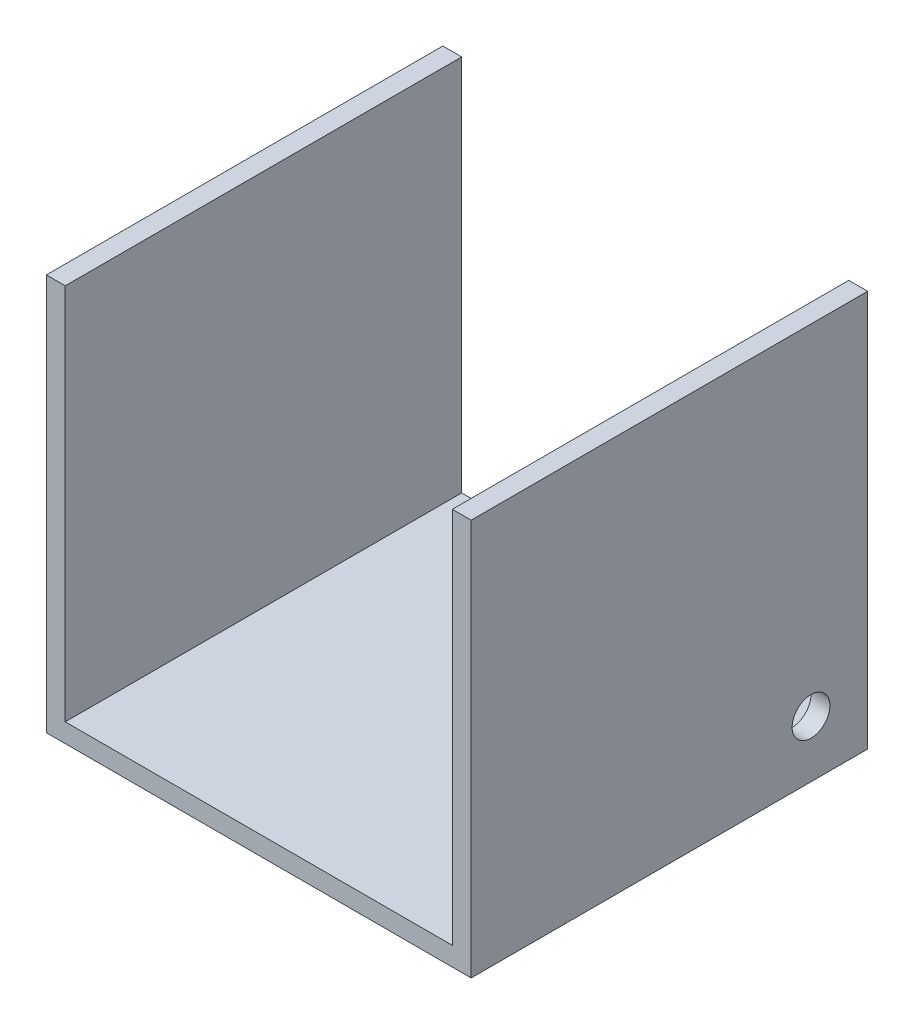
ISO-10303-21;
HEADER;
FILE_DESCRIPTION(('STEP AP214'),'2;1');
FILE_NAME('part.step','',(''),(''),'','','');
FILE_SCHEMA(('AUTOMOTIVE_DESIGN { 1 0 10303 214 1 1 1 1 }'));
ENDSEC;
DATA;
#1=APPLICATION_CONTEXT('core data for automotive mechanical design processes');
#2=APPLICATION_PROTOCOL_DEFINITION('international standard','automotive_design',2000,#1);
#3=PRODUCT_CONTEXT('',#1,'mechanical');
#4=PRODUCT('Part','Part','',(#3));
#5=PRODUCT_RELATED_PRODUCT_CATEGORY('part','',(#4));
#6=PRODUCT_DEFINITION_FORMATION('','',#4);
#7=PRODUCT_DEFINITION_CONTEXT('part definition',#1,'design');
#8=PRODUCT_DEFINITION('design','',#6,#7);
#9=PRODUCT_DEFINITION_SHAPE('','',#8);
#10=(LENGTH_UNIT() NAMED_UNIT(*) SI_UNIT(.MILLI.,.METRE.));
#11=(NAMED_UNIT(*) PLANE_ANGLE_UNIT() SI_UNIT($,.RADIAN.));
#12=(NAMED_UNIT(*) SI_UNIT($,.STERADIAN.) SOLID_ANGLE_UNIT());
#13=UNCERTAINTY_MEASURE_WITH_UNIT(LENGTH_MEASURE(1.E-05),#10,'distance_accuracy_value','');
#14=(GEOMETRIC_REPRESENTATION_CONTEXT(3) GLOBAL_UNCERTAINTY_ASSIGNED_CONTEXT((#13)) GLOBAL_UNIT_ASSIGNED_CONTEXT((#10,
#11,#12)) REPRESENTATION_CONTEXT('',''));
#15=CARTESIAN_POINT('',(0.,0.,0.));
#16=DIRECTION('',(0.,0.,1.));
#17=DIRECTION('',(1.,0.,0.));
#18=AXIS2_PLACEMENT_3D('',#15,#16,#17);
#19=CARTESIAN_POINT('',(0.,0.,-210.));
#20=DIRECTION('',(0.,-1.,0.));
#21=DIRECTION('',(0.,0.,-1.));
#22=AXIS2_PLACEMENT_3D('',#19,#20,#21);
#23=PLANE('',#22);
#24=CARTESIAN_POINT('',(107.,0.,-180.));
#25=DIRECTION('',(0.,1.,0.));
#26=DIRECTION('',(0.,0.,1.));
#27=AXIS2_PLACEMENT_3D('',#24,#25,#26);
#28=CIRCLE('',#27,1.44999999999999);
#29=CARTESIAN_POINT('',(107.,0.,-178.55));
#30=VERTEX_POINT('',#29);
#31=EDGE_CURVE('E464',#30,#30,#28,.T.);
#32=ORIENTED_EDGE('',*,*,#31,.T.);
#33=EDGE_LOOP('',(#32));
#34=FACE_BOUND('',#33,.T.);
#35=CARTESIAN_POINT('',(107.,0.,-131.4));
#36=DIRECTION('',(0.,1.,0.));
#37=DIRECTION('',(0.,0.,1.));
#38=AXIS2_PLACEMENT_3D('',#35,#36,#37);
#39=CIRCLE('',#38,1.44999999999999);
#40=CARTESIAN_POINT('',(107.,0.,-129.95));
#41=VERTEX_POINT('',#40);
#42=EDGE_CURVE('E477',#41,#41,#39,.T.);
#43=ORIENTED_EDGE('',*,*,#42,.T.);
#44=EDGE_LOOP('',(#43));
#45=FACE_BOUND('',#44,.T.);
#46=CARTESIAN_POINT('',(165.,0.,-131.4));
#47=DIRECTION('',(0.,1.,0.));
#48=DIRECTION('',(0.,0.,1.));
#49=AXIS2_PLACEMENT_3D('',#46,#47,#48);
#50=CIRCLE('',#49,1.45000000000001);
#51=CARTESIAN_POINT('',(165.,0.,-129.95));
#52=VERTEX_POINT('',#51);
#53=EDGE_CURVE('E240',#52,#52,#50,.T.);
#54=ORIENTED_EDGE('',*,*,#53,.T.);
#55=EDGE_LOOP('',(#54));
#56=FACE_BOUND('',#55,.T.);
#57=DIRECTION('',(1.,0.,0.));
#58=VECTOR('',#57,1.);
#59=CARTESIAN_POINT('',(0.,0.,0.));
#60=LINE('',#59,#58);
#61=CARTESIAN_POINT('',(0.,0.,0.));
#62=VERTEX_POINT('',#61);
#63=CARTESIAN_POINT('',(225.,0.,0.));
#64=VERTEX_POINT('',#63);
#65=EDGE_CURVE('E147',#62,#64,#60,.T.);
#66=ORIENTED_EDGE('',*,*,#65,.F.);
#67=DIRECTION('',(0.,0.,1.));
#68=VECTOR('',#67,1.);
#69=CARTESIAN_POINT('',(0.,0.,-210.));
#70=LINE('',#69,#68);
#71=CARTESIAN_POINT('',(0.,0.,-210.));
#72=VERTEX_POINT('',#71);
#73=EDGE_CURVE('E43',#72,#62,#70,.T.);
#74=ORIENTED_EDGE('',*,*,#73,.F.);
#75=DIRECTION('',(1.,0.,0.));
#76=VECTOR('',#75,1.);
#77=CARTESIAN_POINT('',(0.,0.,-210.));
#78=LINE('',#77,#76);
#79=CARTESIAN_POINT('',(225.,0.,-210.));
#80=VERTEX_POINT('',#79);
#81=EDGE_CURVE('E268',#72,#80,#78,.T.);
#82=ORIENTED_EDGE('',*,*,#81,.T.);
#83=DIRECTION('',(0.,0.,1.));
#84=VECTOR('',#83,1.);
#85=CARTESIAN_POINT('',(225.,0.,-210.));
#86=LINE('',#85,#84);
#87=EDGE_CURVE('E183',#80,#64,#86,.T.);
#88=ORIENTED_EDGE('',*,*,#87,.T.);
#89=EDGE_LOOP('',(#66,#74,#82,#88));
#90=FACE_BOUND('',#89,.T.);
#91=CARTESIAN_POINT('',(165.,0.,-180.));
#92=DIRECTION('',(0.,1.,0.));
#93=DIRECTION('',(0.,0.,1.));
#94=AXIS2_PLACEMENT_3D('',#91,#92,#93);
#95=CIRCLE('',#94,1.45000000000001);
#96=CARTESIAN_POINT('',(165.,0.,-178.55));
#97=VERTEX_POINT('',#96);
#98=EDGE_CURVE('E255',#97,#97,#95,.T.);
#99=ORIENTED_EDGE('',*,*,#98,.T.);
#100=EDGE_LOOP('',(#99));
#101=FACE_BOUND('',#100,.T.);
#102=ADVANCED_FACE('F39',(#34,#45,#56,#90,#101),#23,.T.);
#103=CARTESIAN_POINT('',(0.,210.,-210.));
#104=DIRECTION('',(-1.,0.,0.));
#105=DIRECTION('',(0.,-1.,0.));
#106=AXIS2_PLACEMENT_3D('',#103,#104,#105);
#107=PLANE('',#106);
#108=DIRECTION('',(0.,-1.,0.));
#109=VECTOR('',#108,1.);
#110=CARTESIAN_POINT('',(0.,210.,0.));
#111=LINE('',#110,#109);
#112=CARTESIAN_POINT('',(0.,210.,0.));
#113=VERTEX_POINT('',#112);
#114=EDGE_CURVE('E143',#113,#62,#111,.T.);
#115=ORIENTED_EDGE('',*,*,#114,.F.);
#116=DIRECTION('',(0.,0.,1.));
#117=VECTOR('',#116,1.);
#118=CARTESIAN_POINT('',(0.,210.,-210.));
#119=LINE('',#118,#117);
#120=CARTESIAN_POINT('',(0.,210.,-210.));
#121=VERTEX_POINT('',#120);
#122=EDGE_CURVE('E11',#121,#113,#119,.T.);
#123=ORIENTED_EDGE('',*,*,#122,.F.);
#124=DIRECTION('',(0.,-1.,0.));
#125=VECTOR('',#124,1.);
#126=CARTESIAN_POINT('',(0.,210.,-210.));
#127=LINE('',#126,#125);
#128=EDGE_CURVE('E172',#121,#72,#127,.T.);
#129=ORIENTED_EDGE('',*,*,#128,.T.);
#130=ORIENTED_EDGE('',*,*,#73,.T.);
#131=EDGE_LOOP('',(#115,#123,#129,#130));
#132=FACE_BOUND('',#131,.T.);
#133=ADVANCED_FACE('F41',(#132),#107,.T.);
#134=CARTESIAN_POINT('',(10.,210.,-210.));
#135=DIRECTION('',(0.,1.,0.));
#136=DIRECTION('',(0.,0.,1.));
#137=AXIS2_PLACEMENT_3D('',#134,#135,#136);
#138=PLANE('',#137);
#139=DIRECTION('',(-1.,0.,0.));
#140=VECTOR('',#139,1.);
#141=CARTESIAN_POINT('',(10.,210.,0.));
#142=LINE('',#141,#140);
#143=CARTESIAN_POINT('',(10.,210.,0.));
#144=VERTEX_POINT('',#143);
#145=EDGE_CURVE('E169',#144,#113,#142,.T.);
#146=ORIENTED_EDGE('',*,*,#145,.F.);
#147=DIRECTION('',(0.,0.,1.));
#148=VECTOR('',#147,1.);
#149=CARTESIAN_POINT('',(10.,210.,-210.));
#150=LINE('',#149,#148);
#151=CARTESIAN_POINT('',(10.,210.,-210.));
#152=VERTEX_POINT('',#151);
#153=EDGE_CURVE('E50',#152,#144,#150,.T.);
#154=ORIENTED_EDGE('',*,*,#153,.F.);
#155=DIRECTION('',(-1.,0.,0.));
#156=VECTOR('',#155,1.);
#157=CARTESIAN_POINT('',(10.,210.,-210.));
#158=LINE('',#157,#156);
#159=EDGE_CURVE('E129',#152,#121,#158,.T.);
#160=ORIENTED_EDGE('',*,*,#159,.T.);
#161=ORIENTED_EDGE('',*,*,#122,.T.);
#162=EDGE_LOOP('',(#146,#154,#160,#161));
#163=FACE_BOUND('',#162,.T.);
#164=ADVANCED_FACE('F190',(#163),#138,.T.);
#165=CARTESIAN_POINT('',(10.,9.99999999999998,-210.));
#166=DIRECTION('',(1.,0.,0.));
#167=DIRECTION('',(0.,0.,-1.));
#168=AXIS2_PLACEMENT_3D('',#165,#166,#167);
#169=PLANE('',#168);
#170=DIRECTION('',(0.,1.,0.));
#171=VECTOR('',#170,1.);
#172=CARTESIAN_POINT('',(10.,9.99999999999998,0.));
#173=LINE('',#172,#171);
#174=CARTESIAN_POINT('',(10.,9.99999999999998,0.));
#175=VERTEX_POINT('',#174);
#176=EDGE_CURVE('E115',#175,#144,#173,.T.);
#177=ORIENTED_EDGE('',*,*,#176,.F.);
#178=DIRECTION('',(0.,0.,1.));
#179=VECTOR('',#178,1.);
#180=CARTESIAN_POINT('',(10.,9.99999999999998,-210.));
#181=LINE('',#180,#179);
#182=CARTESIAN_POINT('',(10.,9.99999999999998,-210.));
#183=VERTEX_POINT('',#182);
#184=EDGE_CURVE('E110',#183,#175,#181,.T.);
#185=ORIENTED_EDGE('',*,*,#184,.F.);
#186=DIRECTION('',(0.,1.,0.));
#187=VECTOR('',#186,1.);
#188=CARTESIAN_POINT('',(10.,9.99999999999998,-210.));
#189=LINE('',#188,#187);
#190=EDGE_CURVE('E113',#183,#152,#189,.T.);
#191=ORIENTED_EDGE('',*,*,#190,.T.);
#192=ORIENTED_EDGE('',*,*,#153,.T.);
#193=EDGE_LOOP('',(#177,#185,#191,#192));
#194=FACE_BOUND('',#193,.T.);
#195=ADVANCED_FACE('F112',(#194),#169,.T.);
#196=CARTESIAN_POINT('',(215.,10.,-210.));
#197=DIRECTION('',(0.,1.,0.));
#198=DIRECTION('',(-1.,0.,0.));
#199=AXIS2_PLACEMENT_3D('',#196,#197,#198);
#200=PLANE('',#199);
#201=CARTESIAN_POINT('',(107.,9.99999999999999,-180.));
#202=DIRECTION('',(0.,1.,0.));
#203=DIRECTION('',(0.,0.,1.));
#204=AXIS2_PLACEMENT_3D('',#201,#202,#203);
#205=CIRCLE('',#204,4.);
#206=CARTESIAN_POINT('',(107.,9.99999999999999,-176.));
#207=VERTEX_POINT('',#206);
#208=EDGE_CURVE('E225',#207,#207,#205,.T.);
#209=ORIENTED_EDGE('',*,*,#208,.F.);
#210=EDGE_LOOP('',(#209));
#211=FACE_BOUND('',#210,.T.);
#212=CARTESIAN_POINT('',(107.,9.99999999999999,-131.4));
#213=DIRECTION('',(0.,1.,0.));
#214=DIRECTION('',(0.,0.,1.));
#215=AXIS2_PLACEMENT_3D('',#212,#213,#214);
#216=CIRCLE('',#215,4.);
#217=CARTESIAN_POINT('',(107.,9.99999999999999,-127.4));
#218=VERTEX_POINT('',#217);
#219=EDGE_CURVE('E229',#218,#218,#216,.T.);
#220=ORIENTED_EDGE('',*,*,#219,.F.);
#221=EDGE_LOOP('',(#220));
#222=FACE_BOUND('',#221,.T.);
#223=CARTESIAN_POINT('',(165.,10.,-131.4));
#224=DIRECTION('',(0.,1.,0.));
#225=DIRECTION('',(0.,0.,1.));
#226=AXIS2_PLACEMENT_3D('',#223,#224,#225);
#227=CIRCLE('',#226,4.);
#228=CARTESIAN_POINT('',(165.,10.,-127.4));
#229=VERTEX_POINT('',#228);
#230=EDGE_CURVE('E233',#229,#229,#227,.T.);
#231=ORIENTED_EDGE('',*,*,#230,.F.);
#232=EDGE_LOOP('',(#231));
#233=FACE_BOUND('',#232,.T.);
#234=CARTESIAN_POINT('',(165.,10.,-180.));
#235=DIRECTION('',(0.,1.,0.));
#236=DIRECTION('',(0.,0.,1.));
#237=AXIS2_PLACEMENT_3D('',#234,#235,#236);
#238=CIRCLE('',#237,4.);
#239=CARTESIAN_POINT('',(165.,10.,-176.));
#240=VERTEX_POINT('',#239);
#241=EDGE_CURVE('E236',#240,#240,#238,.T.);
#242=ORIENTED_EDGE('',*,*,#241,.F.);
#243=EDGE_LOOP('',(#242));
#244=FACE_BOUND('',#243,.T.);
#245=DIRECTION('',(-1.,0.,0.));
#246=VECTOR('',#245,1.);
#247=CARTESIAN_POINT('',(215.,10.,0.));
#248=LINE('',#247,#246);
#249=CARTESIAN_POINT('',(215.,10.,0.));
#250=VERTEX_POINT('',#249);
#251=EDGE_CURVE('E164',#250,#175,#248,.T.);
#252=ORIENTED_EDGE('',*,*,#251,.F.);
#253=DIRECTION('',(0.,0.,1.));
#254=VECTOR('',#253,1.);
#255=CARTESIAN_POINT('',(215.,10.,-210.));
#256=LINE('',#255,#254);
#257=CARTESIAN_POINT('',(215.,10.,-210.));
#258=VERTEX_POINT('',#257);
#259=EDGE_CURVE('E121',#258,#250,#256,.T.);
#260=ORIENTED_EDGE('',*,*,#259,.F.);
#261=DIRECTION('',(-1.,0.,0.));
#262=VECTOR('',#261,1.);
#263=CARTESIAN_POINT('',(215.,10.,-210.));
#264=LINE('',#263,#262);
#265=EDGE_CURVE('E127',#258,#183,#264,.T.);
#266=ORIENTED_EDGE('',*,*,#265,.T.);
#267=ORIENTED_EDGE('',*,*,#184,.T.);
#268=EDGE_LOOP('',(#252,#260,#266,#267));
#269=FACE_BOUND('',#268,.T.);
#270=ADVANCED_FACE('F132',(#211,#222,#233,#244,#269),#200,.T.);
#271=CARTESIAN_POINT('',(215.,210.,-210.));
#272=DIRECTION('',(-1.,0.,0.));
#273=DIRECTION('',(0.,-1.,0.));
#274=AXIS2_PLACEMENT_3D('',#271,#272,#273);
#275=PLANE('',#274);
#276=CARTESIAN_POINT('',(215.,30.,-180.));
#277=DIRECTION('',(1.,0.,0.));
#278=DIRECTION('',(0.,0.,-1.));
#279=AXIS2_PLACEMENT_3D('',#276,#277,#278);
#280=CIRCLE('',#279,10.);
#281=CARTESIAN_POINT('',(215.,30.,-190.));
#282=VERTEX_POINT('',#281);
#283=EDGE_CURVE('E148',#282,#282,#280,.T.);
#284=ORIENTED_EDGE('',*,*,#283,.T.);
#285=EDGE_LOOP('',(#284));
#286=FACE_BOUND('',#285,.T.);
#287=DIRECTION('',(0.,-1.,0.));
#288=VECTOR('',#287,1.);
#289=CARTESIAN_POINT('',(215.,210.,0.));
#290=LINE('',#289,#288);
#291=CARTESIAN_POINT('',(215.,210.,0.));
#292=VERTEX_POINT('',#291);
#293=EDGE_CURVE('E160',#292,#250,#290,.T.);
#294=ORIENTED_EDGE('',*,*,#293,.F.);
#295=DIRECTION('',(0.,0.,1.));
#296=VECTOR('',#295,1.);
#297=CARTESIAN_POINT('',(215.,210.,-210.));
#298=LINE('',#297,#296);
#299=CARTESIAN_POINT('',(215.,210.,-210.));
#300=VERTEX_POINT('',#299);
#301=EDGE_CURVE('E178',#300,#292,#298,.T.);
#302=ORIENTED_EDGE('',*,*,#301,.F.);
#303=DIRECTION('',(0.,-1.,0.));
#304=VECTOR('',#303,1.);
#305=CARTESIAN_POINT('',(215.,210.,-210.));
#306=LINE('',#305,#304);
#307=EDGE_CURVE('E134',#300,#258,#306,.T.);
#308=ORIENTED_EDGE('',*,*,#307,.T.);
#309=ORIENTED_EDGE('',*,*,#259,.T.);
#310=EDGE_LOOP('',(#294,#302,#308,#309));
#311=FACE_BOUND('',#310,.T.);
#312=ADVANCED_FACE('F213',(#286,#311),#275,.T.);
#313=CARTESIAN_POINT('',(225.,210.,-210.));
#314=DIRECTION('',(0.,1.,0.));
#315=DIRECTION('',(-1.,0.,0.));
#316=AXIS2_PLACEMENT_3D('',#313,#314,#315);
#317=PLANE('',#316);
#318=DIRECTION('',(-1.,0.,0.));
#319=VECTOR('',#318,1.);
#320=CARTESIAN_POINT('',(225.,210.,0.));
#321=LINE('',#320,#319);
#322=CARTESIAN_POINT('',(225.,210.,0.));
#323=VERTEX_POINT('',#322);
#324=EDGE_CURVE('E156',#323,#292,#321,.T.);
#325=ORIENTED_EDGE('',*,*,#324,.F.);
#326=DIRECTION('',(0.,0.,1.));
#327=VECTOR('',#326,1.);
#328=CARTESIAN_POINT('',(225.,210.,-210.));
#329=LINE('',#328,#327);
#330=CARTESIAN_POINT('',(225.,210.,-210.));
#331=VERTEX_POINT('',#330);
#332=EDGE_CURVE('E181',#331,#323,#329,.T.);
#333=ORIENTED_EDGE('',*,*,#332,.F.);
#334=DIRECTION('',(-1.,0.,0.));
#335=VECTOR('',#334,1.);
#336=CARTESIAN_POINT('',(225.,210.,-210.));
#337=LINE('',#336,#335);
#338=EDGE_CURVE('E137',#331,#300,#337,.T.);
#339=ORIENTED_EDGE('',*,*,#338,.T.);
#340=ORIENTED_EDGE('',*,*,#301,.T.);
#341=EDGE_LOOP('',(#325,#333,#339,#340));
#342=FACE_BOUND('',#341,.T.);
#343=ADVANCED_FACE('F209',(#342),#317,.T.);
#344=CARTESIAN_POINT('',(225.,0.,-210.));
#345=DIRECTION('',(1.,0.,0.));
#346=DIRECTION('',(0.,0.,-1.));
#347=AXIS2_PLACEMENT_3D('',#344,#345,#346);
#348=PLANE('',#347);
#349=CARTESIAN_POINT('',(225.,30.,-180.));
#350=DIRECTION('',(1.,0.,0.));
#351=DIRECTION('',(0.,0.,-1.));
#352=AXIS2_PLACEMENT_3D('',#349,#350,#351);
#353=CIRCLE('',#352,10.);
#354=CARTESIAN_POINT('',(225.,30.,-190.));
#355=VERTEX_POINT('',#354);
#356=EDGE_CURVE('E259',#355,#355,#353,.T.);
#357=ORIENTED_EDGE('',*,*,#356,.F.);
#358=EDGE_LOOP('',(#357));
#359=FACE_BOUND('',#358,.T.);
#360=DIRECTION('',(0.,1.,0.));
#361=VECTOR('',#360,1.);
#362=CARTESIAN_POINT('',(225.,0.,0.));
#363=LINE('',#362,#361);
#364=EDGE_CURVE('E152',#64,#323,#363,.T.);
#365=ORIENTED_EDGE('',*,*,#364,.F.);
#366=ORIENTED_EDGE('',*,*,#87,.F.);
#367=DIRECTION('',(0.,1.,0.));
#368=VECTOR('',#367,1.);
#369=CARTESIAN_POINT('',(225.,0.,-210.));
#370=LINE('',#369,#368);
#371=EDGE_CURVE('E271',#80,#331,#370,.T.);
#372=ORIENTED_EDGE('',*,*,#371,.T.);
#373=ORIENTED_EDGE('',*,*,#332,.T.);
#374=EDGE_LOOP('',(#365,#366,#372,#373));
#375=FACE_BOUND('',#374,.T.);
#376=ADVANCED_FACE('F206',(#359,#375),#348,.T.);
#377=CARTESIAN_POINT('',(0.,0.,-210.));
#378=DIRECTION('',(0.,0.,1.));
#379=DIRECTION('',(1.,0.,0.));
#380=AXIS2_PLACEMENT_3D('',#377,#378,#379);
#381=PLANE('',#380);
#382=ORIENTED_EDGE('',*,*,#128,.F.);
#383=ORIENTED_EDGE('',*,*,#159,.F.);
#384=ORIENTED_EDGE('',*,*,#190,.F.);
#385=ORIENTED_EDGE('',*,*,#265,.F.);
#386=ORIENTED_EDGE('',*,*,#307,.F.);
#387=ORIENTED_EDGE('',*,*,#338,.F.);
#388=ORIENTED_EDGE('',*,*,#371,.F.);
#389=ORIENTED_EDGE('',*,*,#81,.F.);
#390=EDGE_LOOP('',(#382,#383,#384,#385,#386,#387,#388,#389));
#391=FACE_BOUND('',#390,.T.);
#392=ADVANCED_FACE('F125',(#391),#381,.F.);
#393=CARTESIAN_POINT('',(0.,0.,0.));
#394=DIRECTION('',(0.,0.,1.));
#395=DIRECTION('',(1.,0.,0.));
#396=AXIS2_PLACEMENT_3D('',#393,#394,#395);
#397=PLANE('',#396);
#398=ORIENTED_EDGE('',*,*,#114,.T.);
#399=ORIENTED_EDGE('',*,*,#65,.T.);
#400=ORIENTED_EDGE('',*,*,#364,.T.);
#401=ORIENTED_EDGE('',*,*,#324,.T.);
#402=ORIENTED_EDGE('',*,*,#293,.T.);
#403=ORIENTED_EDGE('',*,*,#251,.T.);
#404=ORIENTED_EDGE('',*,*,#176,.T.);
#405=ORIENTED_EDGE('',*,*,#145,.T.);
#406=EDGE_LOOP('',(#398,#399,#400,#401,#402,#403,#404,#405));
#407=FACE_BOUND('',#406,.T.);
#408=ADVANCED_FACE('F189',(#407),#397,.T.);
#409=CARTESIAN_POINT('',(215.,30.,-180.));
#410=DIRECTION('',(1.,0.,0.));
#411=DIRECTION('',(0.,0.,-1.));
#412=AXIS2_PLACEMENT_3D('',#409,#410,#411);
#413=CYLINDRICAL_SURFACE('',#412,10.);
#414=ORIENTED_EDGE('',*,*,#283,.F.);
#415=EDGE_LOOP('',(#414));
#416=FACE_BOUND('',#415,.T.);
#417=ORIENTED_EDGE('',*,*,#356,.T.);
#418=EDGE_LOOP('',(#417));
#419=FACE_BOUND('',#418,.T.);
#420=ADVANCED_FACE('F284',(#416,#419),#413,.F.);
#421=CARTESIAN_POINT('',(165.,10.,-180.));
#422=DIRECTION('',(0.,1.,0.));
#423=DIRECTION('',(0.,0.,1.));
#424=AXIS2_PLACEMENT_3D('',#421,#422,#423);
#425=CYLINDRICAL_SURFACE('',#424,1.45000000000001);
#426=ORIENTED_EDGE('',*,*,#98,.F.);
#427=EDGE_LOOP('',(#426));
#428=FACE_BOUND('',#427,.T.);
#429=CARTESIAN_POINT('',(165.,9.5,-180.));
#430=DIRECTION('',(0.,1.,0.));
#431=DIRECTION('',(0.,0.,1.));
#432=AXIS2_PLACEMENT_3D('',#429,#430,#431);
#433=CIRCLE('',#432,1.45000000000001);
#434=CARTESIAN_POINT('',(165.,9.5,-178.55));
#435=VERTEX_POINT('',#434);
#436=EDGE_CURVE('E245',#435,#435,#433,.T.);
#437=ORIENTED_EDGE('',*,*,#436,.T.);
#438=EDGE_LOOP('',(#437));
#439=FACE_BOUND('',#438,.T.);
#440=ADVANCED_FACE('F286',(#428,#439),#425,.F.);
#441=CARTESIAN_POINT('',(166.45,9.5,-180.));
#442=DIRECTION('',(0.,-1.,0.));
#443=DIRECTION('',(0.,0.,-1.));
#444=AXIS2_PLACEMENT_3D('',#441,#442,#443);
#445=PLANE('',#444);
#446=ORIENTED_EDGE('',*,*,#436,.F.);
#447=EDGE_LOOP('',(#446));
#448=FACE_BOUND('',#447,.T.);
#449=CARTESIAN_POINT('',(165.,9.5,-180.));
#450=DIRECTION('',(0.,1.,0.));
#451=DIRECTION('',(0.,0.,1.));
#452=AXIS2_PLACEMENT_3D('',#449,#450,#451);
#453=CIRCLE('',#452,4.);
#454=CARTESIAN_POINT('',(165.,9.5,-176.));
#455=VERTEX_POINT('',#454);
#456=EDGE_CURVE('E239',#455,#455,#453,.T.);
#457=ORIENTED_EDGE('',*,*,#456,.T.);
#458=EDGE_LOOP('',(#457));
#459=FACE_BOUND('',#458,.T.);
#460=ADVANCED_FACE('F293',(#448,#459),#445,.F.);
#461=CARTESIAN_POINT('',(165.,10.,-180.));
#462=DIRECTION('',(0.,1.,0.));
#463=DIRECTION('',(0.,0.,1.));
#464=AXIS2_PLACEMENT_3D('',#461,#462,#463);
#465=CYLINDRICAL_SURFACE('',#464,4.);
#466=ORIENTED_EDGE('',*,*,#456,.F.);
#467=EDGE_LOOP('',(#466));
#468=FACE_BOUND('',#467,.T.);
#469=ORIENTED_EDGE('',*,*,#241,.T.);
#470=EDGE_LOOP('',(#469));
#471=FACE_BOUND('',#470,.T.);
#472=ADVANCED_FACE('F348',(#468,#471),#465,.F.);
#473=CARTESIAN_POINT('',(165.,10.,-131.4));
#474=DIRECTION('',(0.,1.,0.));
#475=DIRECTION('',(0.,0.,1.));
#476=AXIS2_PLACEMENT_3D('',#473,#474,#475);
#477=CYLINDRICAL_SURFACE('',#476,1.45000000000001);
#478=ORIENTED_EDGE('',*,*,#53,.F.);
#479=EDGE_LOOP('',(#478));
#480=FACE_BOUND('',#479,.T.);
#481=CARTESIAN_POINT('',(165.,9.5,-131.4));
#482=DIRECTION('',(0.,1.,0.));
#483=DIRECTION('',(0.,0.,1.));
#484=AXIS2_PLACEMENT_3D('',#481,#482,#483);
#485=CIRCLE('',#484,1.45000000000001);
#486=CARTESIAN_POINT('',(165.,9.5,-129.95));
#487=VERTEX_POINT('',#486);
#488=EDGE_CURVE('E248',#487,#487,#485,.T.);
#489=ORIENTED_EDGE('',*,*,#488,.T.);
#490=EDGE_LOOP('',(#489));
#491=FACE_BOUND('',#490,.T.);
#492=ADVANCED_FACE('F357',(#480,#491),#477,.F.);
#493=CARTESIAN_POINT('',(166.45,9.5,-131.4));
#494=DIRECTION('',(0.,-1.,0.));
#495=DIRECTION('',(0.,0.,-1.));
#496=AXIS2_PLACEMENT_3D('',#493,#494,#495);
#497=PLANE('',#496);
#498=ORIENTED_EDGE('',*,*,#488,.F.);
#499=EDGE_LOOP('',(#498));
#500=FACE_BOUND('',#499,.T.);
#501=CARTESIAN_POINT('',(165.,9.5,-131.4));
#502=DIRECTION('',(0.,1.,0.));
#503=DIRECTION('',(0.,0.,1.));
#504=AXIS2_PLACEMENT_3D('',#501,#502,#503);
#505=CIRCLE('',#504,4.);
#506=CARTESIAN_POINT('',(165.,9.5,-127.4));
#507=VERTEX_POINT('',#506);
#508=EDGE_CURVE('E483',#507,#507,#505,.T.);
#509=ORIENTED_EDGE('',*,*,#508,.T.);
#510=EDGE_LOOP('',(#509));
#511=FACE_BOUND('',#510,.T.);
#512=ADVANCED_FACE('F367',(#500,#511),#497,.F.);
#513=CARTESIAN_POINT('',(165.,10.,-131.4));
#514=DIRECTION('',(0.,1.,0.));
#515=DIRECTION('',(0.,0.,1.));
#516=AXIS2_PLACEMENT_3D('',#513,#514,#515);
#517=CYLINDRICAL_SURFACE('',#516,4.);
#518=ORIENTED_EDGE('',*,*,#508,.F.);
#519=EDGE_LOOP('',(#518));
#520=FACE_BOUND('',#519,.T.);
#521=ORIENTED_EDGE('',*,*,#230,.T.);
#522=EDGE_LOOP('',(#521));
#523=FACE_BOUND('',#522,.T.);
#524=ADVANCED_FACE('F377',(#520,#523),#517,.F.);
#525=CARTESIAN_POINT('',(107.,9.99999999999999,-131.4));
#526=DIRECTION('',(0.,1.,0.));
#527=DIRECTION('',(0.,0.,1.));
#528=AXIS2_PLACEMENT_3D('',#525,#526,#527);
#529=CYLINDRICAL_SURFACE('',#528,1.45);
#530=ORIENTED_EDGE('',*,*,#42,.F.);
#531=EDGE_LOOP('',(#530));
#532=FACE_BOUND('',#531,.T.);
#533=CARTESIAN_POINT('',(107.,9.49999999999999,-131.4));
#534=DIRECTION('',(0.,1.,0.));
#535=DIRECTION('',(0.,0.,1.));
#536=AXIS2_PLACEMENT_3D('',#533,#534,#535);
#537=CIRCLE('',#536,1.45000000000001);
#538=CARTESIAN_POINT('',(107.,9.49999999999999,-129.95));
#539=VERTEX_POINT('',#538);
#540=EDGE_CURVE('E473',#539,#539,#537,.T.);
#541=ORIENTED_EDGE('',*,*,#540,.T.);
#542=EDGE_LOOP('',(#541));
#543=FACE_BOUND('',#542,.T.);
#544=ADVANCED_FACE('F387',(#532,#543),#529,.F.);
#545=CARTESIAN_POINT('',(108.45,9.49999999999999,-131.4));
#546=DIRECTION('',(0.,-1.,0.));
#547=DIRECTION('',(0.,0.,-1.));
#548=AXIS2_PLACEMENT_3D('',#545,#546,#547);
#549=PLANE('',#548);
#550=ORIENTED_EDGE('',*,*,#540,.F.);
#551=EDGE_LOOP('',(#550));
#552=FACE_BOUND('',#551,.T.);
#553=CARTESIAN_POINT('',(107.,9.49999999999999,-131.4));
#554=DIRECTION('',(0.,1.,0.));
#555=DIRECTION('',(0.,0.,1.));
#556=AXIS2_PLACEMENT_3D('',#553,#554,#555);
#557=CIRCLE('',#556,4.);
#558=CARTESIAN_POINT('',(107.,9.49999999999999,-127.4));
#559=VERTEX_POINT('',#558);
#560=EDGE_CURVE('E469',#559,#559,#557,.T.);
#561=ORIENTED_EDGE('',*,*,#560,.T.);
#562=EDGE_LOOP('',(#561));
#563=FACE_BOUND('',#562,.T.);
#564=ADVANCED_FACE('F397',(#552,#563),#549,.F.);
#565=CARTESIAN_POINT('',(107.,9.99999999999999,-131.4));
#566=DIRECTION('',(0.,1.,0.));
#567=DIRECTION('',(0.,0.,1.));
#568=AXIS2_PLACEMENT_3D('',#565,#566,#567);
#569=CYLINDRICAL_SURFACE('',#568,4.);
#570=ORIENTED_EDGE('',*,*,#560,.F.);
#571=EDGE_LOOP('',(#570));
#572=FACE_BOUND('',#571,.T.);
#573=ORIENTED_EDGE('',*,*,#219,.T.);
#574=EDGE_LOOP('',(#573));
#575=FACE_BOUND('',#574,.T.);
#576=ADVANCED_FACE('F407',(#572,#575),#569,.F.);
#577=CARTESIAN_POINT('',(107.,9.99999999999999,-180.));
#578=DIRECTION('',(0.,1.,0.));
#579=DIRECTION('',(0.,0.,1.));
#580=AXIS2_PLACEMENT_3D('',#577,#578,#579);
#581=CYLINDRICAL_SURFACE('',#580,1.45);
#582=ORIENTED_EDGE('',*,*,#31,.F.);
#583=EDGE_LOOP('',(#582));
#584=FACE_BOUND('',#583,.T.);
#585=CARTESIAN_POINT('',(107.,9.49999999999999,-180.));
#586=DIRECTION('',(0.,1.,0.));
#587=DIRECTION('',(0.,0.,1.));
#588=AXIS2_PLACEMENT_3D('',#585,#586,#587);
#589=CIRCLE('',#588,1.45000000000001);
#590=CARTESIAN_POINT('',(107.,9.49999999999999,-178.55));
#591=VERTEX_POINT('',#590);
#592=EDGE_CURVE('E458',#591,#591,#589,.T.);
#593=ORIENTED_EDGE('',*,*,#592,.T.);
#594=EDGE_LOOP('',(#593));
#595=FACE_BOUND('',#594,.T.);
#596=ADVANCED_FACE('F417',(#584,#595),#581,.F.);
#597=CARTESIAN_POINT('',(108.45,9.49999999999999,-180.));
#598=DIRECTION('',(0.,-1.,0.));
#599=DIRECTION('',(0.,0.,-1.));
#600=AXIS2_PLACEMENT_3D('',#597,#598,#599);
#601=PLANE('',#600);
#602=ORIENTED_EDGE('',*,*,#592,.F.);
#603=EDGE_LOOP('',(#602));
#604=FACE_BOUND('',#603,.T.);
#605=CARTESIAN_POINT('',(107.,9.49999999999999,-180.));
#606=DIRECTION('',(0.,1.,0.));
#607=DIRECTION('',(0.,0.,1.));
#608=AXIS2_PLACEMENT_3D('',#605,#606,#607);
#609=CIRCLE('',#608,4.);
#610=CARTESIAN_POINT('',(107.,9.49999999999999,-176.));
#611=VERTEX_POINT('',#610);
#612=EDGE_CURVE('E454',#611,#611,#609,.T.);
#613=ORIENTED_EDGE('',*,*,#612,.T.);
#614=EDGE_LOOP('',(#613));
#615=FACE_BOUND('',#614,.T.);
#616=ADVANCED_FACE('F427',(#604,#615),#601,.F.);
#617=CARTESIAN_POINT('',(107.,9.99999999999999,-180.));
#618=DIRECTION('',(0.,1.,0.));
#619=DIRECTION('',(0.,0.,1.));
#620=AXIS2_PLACEMENT_3D('',#617,#618,#619);
#621=CYLINDRICAL_SURFACE('',#620,4.);
#622=ORIENTED_EDGE('',*,*,#612,.F.);
#623=EDGE_LOOP('',(#622));
#624=FACE_BOUND('',#623,.T.);
#625=ORIENTED_EDGE('',*,*,#208,.T.);
#626=EDGE_LOOP('',(#625));
#627=FACE_BOUND('',#626,.T.);
#628=ADVANCED_FACE('F437',(#624,#627),#621,.F.);
#629=CLOSED_SHELL('',(#102,#133,#164,#195,#270,#312,#343,#376,#392,#408,#420,#440,#460,#472,
#492,#512,#524,#544,#564,#576,#596,#616,#628));
#630=MANIFOLD_SOLID_BREP('B2',#629);
#631=ADVANCED_BREP_SHAPE_REPRESENTATION('',(#18,#630),#14);
#632=SHAPE_DEFINITION_REPRESENTATION(#9,#631);
ENDSEC;
END-ISO-10303-21;
